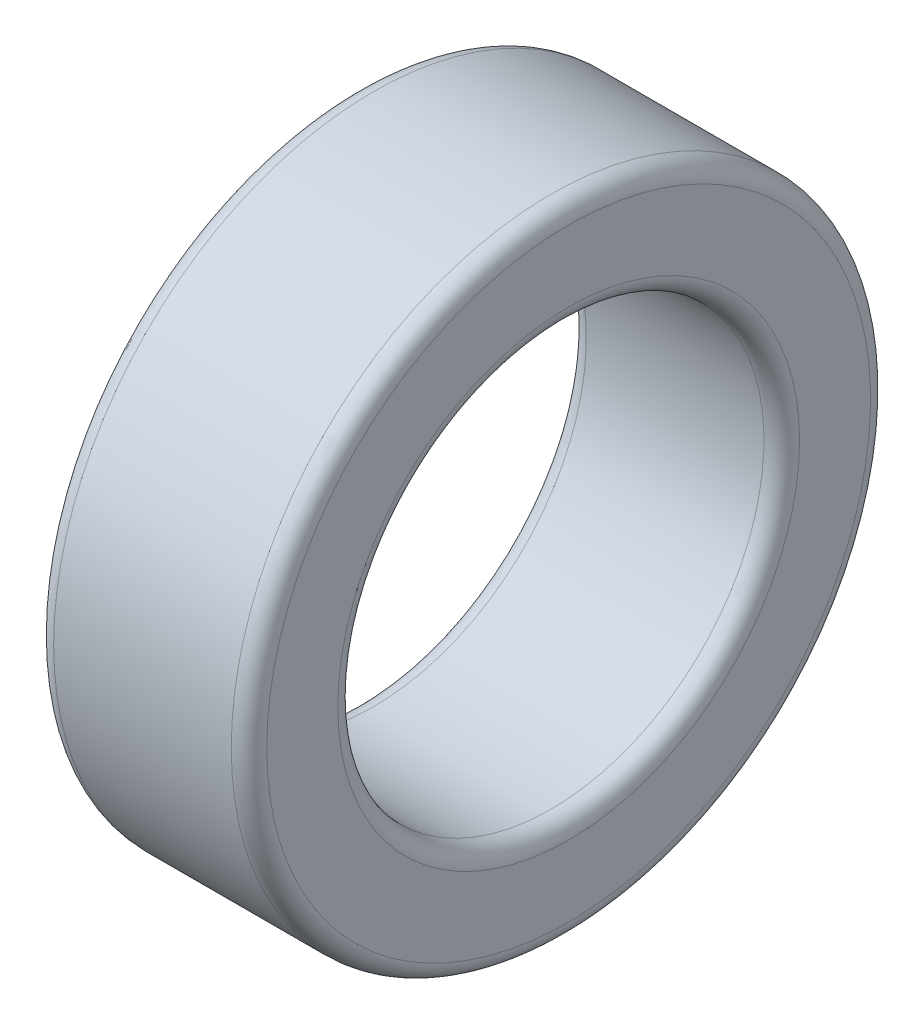
ISO-10303-21;
HEADER;
FILE_DESCRIPTION(('STEP AP214'),'2;1');
FILE_NAME('part.step','',(''),(''),'','','');
FILE_SCHEMA(('AUTOMOTIVE_DESIGN { 1 0 10303 214 1 1 1 1 }'));
ENDSEC;
DATA;
#1=APPLICATION_CONTEXT('core data for automotive mechanical design processes');
#2=APPLICATION_PROTOCOL_DEFINITION('international standard','automotive_design',2000,#1);
#3=PRODUCT_CONTEXT('',#1,'mechanical');
#4=PRODUCT('Part','Part','',(#3));
#5=PRODUCT_RELATED_PRODUCT_CATEGORY('part','',(#4));
#6=PRODUCT_DEFINITION_FORMATION('','',#4);
#7=PRODUCT_DEFINITION_CONTEXT('part definition',#1,'design');
#8=PRODUCT_DEFINITION('design','',#6,#7);
#9=PRODUCT_DEFINITION_SHAPE('','',#8);
#10=(LENGTH_UNIT() NAMED_UNIT(*) SI_UNIT(.MILLI.,.METRE.));
#11=(NAMED_UNIT(*) PLANE_ANGLE_UNIT() SI_UNIT($,.RADIAN.));
#12=(NAMED_UNIT(*) SI_UNIT($,.STERADIAN.) SOLID_ANGLE_UNIT());
#13=UNCERTAINTY_MEASURE_WITH_UNIT(LENGTH_MEASURE(1.E-05),#10,'distance_accuracy_value','');
#14=(GEOMETRIC_REPRESENTATION_CONTEXT(3) GLOBAL_UNCERTAINTY_ASSIGNED_CONTEXT((#13)) GLOBAL_UNIT_ASSIGNED_CONTEXT((#10,
#11,#12)) REPRESENTATION_CONTEXT('',''));
#15=CARTESIAN_POINT('',(0.,0.,0.));
#16=DIRECTION('',(0.,0.,1.));
#17=DIRECTION('',(1.,0.,0.));
#18=AXIS2_PLACEMENT_3D('',#15,#16,#17);
#19=CARTESIAN_POINT('',(5.84,-7.16871162226879,0.96361494234998));
#20=DIRECTION('',(-1.,0.,0.));
#21=DIRECTION('',(0.,0.,1.));
#22=AXIS2_PLACEMENT_3D('',#19,#20,#21);
#23=PLANE('',#22);
#24=CARTESIAN_POINT('',(5.84,-7.16871162226879,8.76361494234999));
#25=DIRECTION('',(1.,0.,0.));
#26=DIRECTION('',(0.,0.,-1.));
#27=AXIS2_PLACEMENT_3D('',#24,#25,#26);
#28=CIRCLE('',#27,7.8);
#29=CARTESIAN_POINT('',(5.84,-7.16871162226879,16.56361494235));
#30=VERTEX_POINT('',#29);
#31=EDGE_CURVE('E111',#30,#30,#28,.T.);
#32=ORIENTED_EDGE('',*,*,#31,.T.);
#33=EDGE_LOOP('',(#32));
#34=FACE_BOUND('',#33,.T.);
#35=CARTESIAN_POINT('',(5.84,-7.16871162226879,8.76361494234999));
#36=DIRECTION('',(1.,0.,0.));
#37=DIRECTION('',(0.,0.,-1.));
#38=AXIS2_PLACEMENT_3D('',#35,#36,#37);
#39=CIRCLE('',#38,10.2);
#40=CARTESIAN_POINT('',(5.84,-7.16871162226879,18.96361494235));
#41=VERTEX_POINT('',#40);
#42=EDGE_CURVE('E55',#41,#41,#39,.T.);
#43=ORIENTED_EDGE('',*,*,#42,.F.);
#44=EDGE_LOOP('',(#43));
#45=FACE_BOUND('',#44,.T.);
#46=ADVANCED_FACE('F16',(#34,#45),#23,.T.);
#47=CARTESIAN_POINT('',(13.04,-7.16871162226879,0.96361494234998));
#48=DIRECTION('',(1.,0.,0.));
#49=DIRECTION('',(0.,1.,0.));
#50=AXIS2_PLACEMENT_3D('',#47,#48,#49);
#51=PLANE('',#50);
#52=CARTESIAN_POINT('',(13.04,-7.16871162226879,8.76361494234999));
#53=DIRECTION('',(1.,0.,0.));
#54=DIRECTION('',(0.,0.,-1.));
#55=AXIS2_PLACEMENT_3D('',#52,#53,#54);
#56=CIRCLE('',#55,7.8);
#57=CARTESIAN_POINT('',(13.04,-7.16871162226879,16.56361494235));
#58=VERTEX_POINT('',#57);
#59=EDGE_CURVE('E89',#58,#58,#56,.T.);
#60=ORIENTED_EDGE('',*,*,#59,.F.);
#61=EDGE_LOOP('',(#60));
#62=FACE_BOUND('',#61,.T.);
#63=CARTESIAN_POINT('',(13.04,-7.16871162226879,8.76361494234999));
#64=DIRECTION('',(1.,0.,0.));
#65=DIRECTION('',(0.,0.,-1.));
#66=AXIS2_PLACEMENT_3D('',#63,#64,#65);
#67=CIRCLE('',#66,10.2);
#68=CARTESIAN_POINT('',(13.04,-7.16871162226879,18.96361494235));
#69=VERTEX_POINT('',#68);
#70=EDGE_CURVE('E27',#69,#69,#67,.T.);
#71=ORIENTED_EDGE('',*,*,#70,.T.);
#72=EDGE_LOOP('',(#71));
#73=FACE_BOUND('',#72,.T.);
#74=ADVANCED_FACE('F18',(#62,#73),#51,.T.);
#75=CARTESIAN_POINT('',(12.44,-7.16871162226879,8.76361494234999));
#76=DIRECTION('',(1.,0.,0.));
#77=DIRECTION('',(0.,0.,-1.));
#78=AXIS2_PLACEMENT_3D('',#75,#76,#77);
#79=TOROIDAL_SURFACE('',#78,10.2,0.6);
#80=ORIENTED_EDGE('',*,*,#70,.F.);
#81=CARTESIAN_POINT('',(12.44,-7.16871162226879,18.96361494235));
#82=DIRECTION('',(0.,-1.,0.));
#83=DIRECTION('',(0.,0.,1.));
#84=AXIS2_PLACEMENT_3D('',#81,#82,#83);
#85=CIRCLE('',#84,0.6);
#86=CARTESIAN_POINT('',(12.44,-7.16871162226879,19.56361494235));
#87=VERTEX_POINT('',#86);
#88=EDGE_CURVE('E11',#69,#87,#85,.T.);
#89=ORIENTED_EDGE('',*,*,#88,.T.);
#90=CARTESIAN_POINT('',(12.44,-7.16871162226879,8.76361494234999));
#91=DIRECTION('',(1.,0.,0.));
#92=DIRECTION('',(0.,0.,-1.));
#93=AXIS2_PLACEMENT_3D('',#90,#91,#92);
#94=CIRCLE('',#93,10.8);
#95=EDGE_CURVE('E103',#87,#87,#94,.T.);
#96=ORIENTED_EDGE('',*,*,#95,.T.);
#97=ORIENTED_EDGE('',*,*,#88,.F.);
#98=EDGE_LOOP('',(#80,#89,#96,#97));
#99=FACE_BOUND('',#98,.T.);
#100=ADVANCED_FACE('F130',(#99),#79,.T.);
#101=CARTESIAN_POINT('',(12.44,-7.16871162226879,8.76361494234999));
#102=DIRECTION('',(1.,0.,0.));
#103=DIRECTION('',(0.,0.,-1.));
#104=AXIS2_PLACEMENT_3D('',#101,#102,#103);
#105=TOROIDAL_SURFACE('',#104,7.8,0.6);
#106=CARTESIAN_POINT('',(12.44,-7.16871162226879,8.76361494234999));
#107=DIRECTION('',(1.,0.,0.));
#108=DIRECTION('',(0.,0.,-1.));
#109=AXIS2_PLACEMENT_3D('',#106,#107,#108);
#110=CIRCLE('',#109,7.2);
#111=CARTESIAN_POINT('',(12.44,-7.16871162226879,15.96361494235));
#112=VERTEX_POINT('',#111);
#113=EDGE_CURVE('E87',#112,#112,#110,.T.);
#114=ORIENTED_EDGE('',*,*,#113,.F.);
#115=CARTESIAN_POINT('',(12.44,-7.16871162226879,16.56361494235));
#116=DIRECTION('',(0.,-1.,0.));
#117=DIRECTION('',(0.,0.,1.));
#118=AXIS2_PLACEMENT_3D('',#115,#116,#117);
#119=CIRCLE('',#118,0.6);
#120=EDGE_CURVE('E85',#112,#58,#119,.T.);
#121=ORIENTED_EDGE('',*,*,#120,.T.);
#122=ORIENTED_EDGE('',*,*,#59,.T.);
#123=ORIENTED_EDGE('',*,*,#120,.F.);
#124=EDGE_LOOP('',(#114,#121,#122,#123));
#125=FACE_BOUND('',#124,.T.);
#126=ADVANCED_FACE('F86',(#125),#105,.T.);
#127=CARTESIAN_POINT('',(9.44,-7.16871162226879,8.76361494234999));
#128=DIRECTION('',(1.,0.,0.));
#129=DIRECTION('',(0.,0.,-1.));
#130=AXIS2_PLACEMENT_3D('',#127,#128,#129);
#131=CYLINDRICAL_SURFACE('',#130,7.2);
#132=CARTESIAN_POINT('',(6.44,-7.16871162226879,8.76361494234999));
#133=DIRECTION('',(1.,0.,0.));
#134=DIRECTION('',(0.,0.,-1.));
#135=AXIS2_PLACEMENT_3D('',#132,#133,#134);
#136=CIRCLE('',#135,7.2);
#137=CARTESIAN_POINT('',(6.44,-7.16871162226879,15.96361494235));
#138=VERTEX_POINT('',#137);
#139=EDGE_CURVE('E99',#138,#138,#136,.T.);
#140=ORIENTED_EDGE('',*,*,#139,.F.);
#141=DIRECTION('',(1.,0.,0.));
#142=VECTOR('',#141,1.);
#143=CARTESIAN_POINT('',(9.44,-7.16871162226879,15.96361494235));
#144=LINE('',#143,#142);
#145=EDGE_CURVE('E77',#138,#112,#144,.T.);
#146=ORIENTED_EDGE('',*,*,#145,.T.);
#147=ORIENTED_EDGE('',*,*,#113,.T.);
#148=ORIENTED_EDGE('',*,*,#145,.F.);
#149=EDGE_LOOP('',(#140,#146,#147,#148));
#150=FACE_BOUND('',#149,.T.);
#151=ADVANCED_FACE('F92',(#150),#131,.F.);
#152=CARTESIAN_POINT('',(6.44,-7.16871162226879,8.76361494234999));
#153=DIRECTION('',(1.,0.,0.));
#154=DIRECTION('',(0.,0.,-1.));
#155=AXIS2_PLACEMENT_3D('',#152,#153,#154);
#156=TOROIDAL_SURFACE('',#155,7.8,0.6);
#157=ORIENTED_EDGE('',*,*,#31,.F.);
#158=CARTESIAN_POINT('',(6.44,-7.16871162226879,16.56361494235));
#159=DIRECTION('',(0.,-1.,0.));
#160=DIRECTION('',(0.,0.,1.));
#161=AXIS2_PLACEMENT_3D('',#158,#159,#160);
#162=CIRCLE('',#161,0.6);
#163=EDGE_CURVE('E107',#30,#138,#162,.T.);
#164=ORIENTED_EDGE('',*,*,#163,.T.);
#165=ORIENTED_EDGE('',*,*,#139,.T.);
#166=ORIENTED_EDGE('',*,*,#163,.F.);
#167=EDGE_LOOP('',(#157,#164,#165,#166));
#168=FACE_BOUND('',#167,.T.);
#169=ADVANCED_FACE('F199',(#168),#156,.T.);
#170=CARTESIAN_POINT('',(6.44,-7.16871162226879,8.76361494234999));
#171=DIRECTION('',(1.,0.,0.));
#172=DIRECTION('',(0.,0.,-1.));
#173=AXIS2_PLACEMENT_3D('',#170,#171,#172);
#174=TOROIDAL_SURFACE('',#173,10.2,0.6);
#175=CARTESIAN_POINT('',(6.44,-7.16871162226879,8.76361494234999));
#176=DIRECTION('',(1.,0.,0.));
#177=DIRECTION('',(0.,0.,-1.));
#178=AXIS2_PLACEMENT_3D('',#175,#176,#177);
#179=CIRCLE('',#178,10.8);
#180=CARTESIAN_POINT('',(6.44,-7.16871162226879,19.56361494235));
#181=VERTEX_POINT('',#180);
#182=EDGE_CURVE('E121',#181,#181,#179,.T.);
#183=ORIENTED_EDGE('',*,*,#182,.F.);
#184=CARTESIAN_POINT('',(6.44,-7.16871162226879,18.96361494235));
#185=DIRECTION('',(0.,-1.,0.));
#186=DIRECTION('',(0.,0.,1.));
#187=AXIS2_PLACEMENT_3D('',#184,#185,#186);
#188=CIRCLE('',#187,0.6);
#189=EDGE_CURVE('E20',#181,#41,#188,.T.);
#190=ORIENTED_EDGE('',*,*,#189,.T.);
#191=ORIENTED_EDGE('',*,*,#42,.T.);
#192=ORIENTED_EDGE('',*,*,#189,.F.);
#193=EDGE_LOOP('',(#183,#190,#191,#192));
#194=FACE_BOUND('',#193,.T.);
#195=ADVANCED_FACE('F132',(#194),#174,.T.);
#196=CARTESIAN_POINT('',(9.44,-7.16871162226879,8.76361494234999));
#197=DIRECTION('',(1.,0.,0.));
#198=DIRECTION('',(0.,0.,-1.));
#199=AXIS2_PLACEMENT_3D('',#196,#197,#198);
#200=CYLINDRICAL_SURFACE('',#199,10.8);
#201=ORIENTED_EDGE('',*,*,#95,.F.);
#202=DIRECTION('',(-1.,0.,0.));
#203=VECTOR('',#202,1.);
#204=CARTESIAN_POINT('',(9.44,-7.16871162226879,19.56361494235));
#205=LINE('',#204,#203);
#206=EDGE_CURVE('E118',#87,#181,#205,.T.);
#207=ORIENTED_EDGE('',*,*,#206,.T.);
#208=ORIENTED_EDGE('',*,*,#182,.T.);
#209=ORIENTED_EDGE('',*,*,#206,.F.);
#210=EDGE_LOOP('',(#201,#207,#208,#209));
#211=FACE_BOUND('',#210,.T.);
#212=ADVANCED_FACE('F131',(#211),#200,.T.);
#213=CLOSED_SHELL('',(#46,#74,#100,#126,#151,#169,#195,#212));
#214=MANIFOLD_SOLID_BREP('B1',#213);
#215=ADVANCED_BREP_SHAPE_REPRESENTATION('',(#18,#214),#14);
#216=SHAPE_DEFINITION_REPRESENTATION(#9,#215);
ENDSEC;
END-ISO-10303-21;
